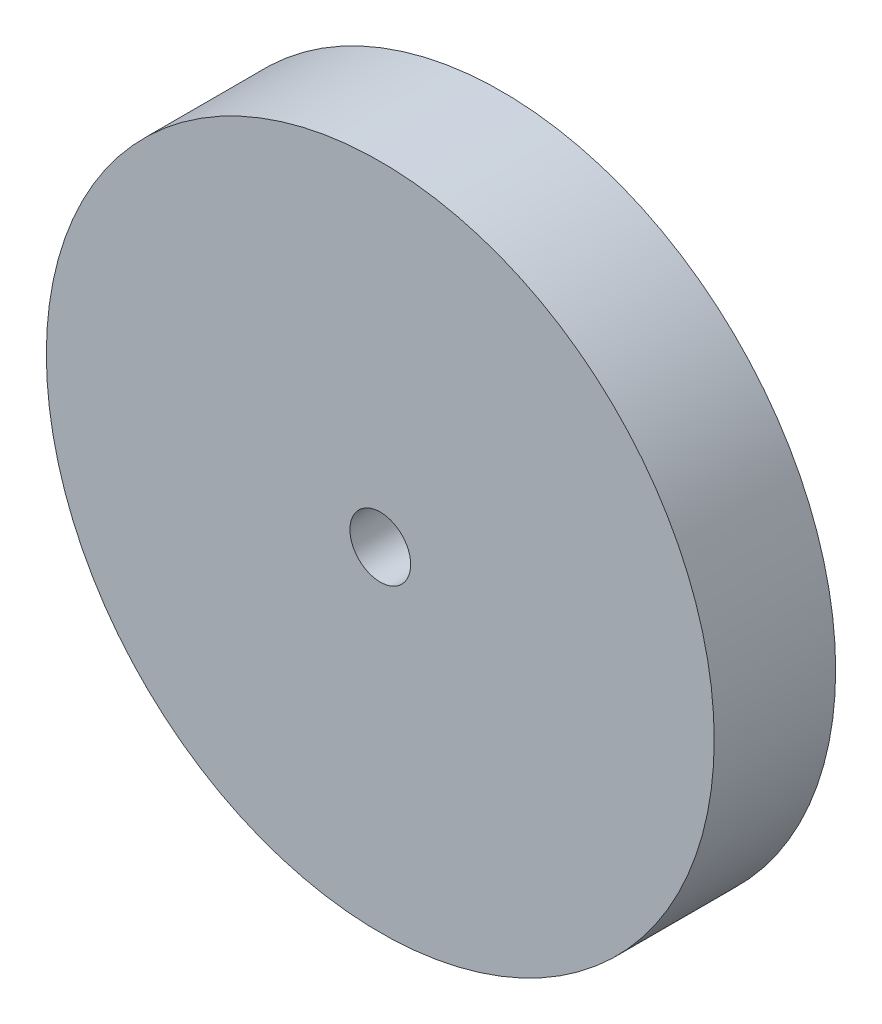
ISO-10303-21;
HEADER;
FILE_DESCRIPTION(('STEP AP214'),'2;1');
FILE_NAME('part.step','',(''),(''),'','','');
FILE_SCHEMA(('AUTOMOTIVE_DESIGN { 1 0 10303 214 1 1 1 1 }'));
ENDSEC;
DATA;
#1=APPLICATION_CONTEXT('core data for automotive mechanical design processes');
#2=APPLICATION_PROTOCOL_DEFINITION('international standard','automotive_design',2000,#1);
#3=PRODUCT_CONTEXT('',#1,'mechanical');
#4=PRODUCT('Part','Part','',(#3));
#5=PRODUCT_RELATED_PRODUCT_CATEGORY('part','',(#4));
#6=PRODUCT_DEFINITION_FORMATION('','',#4);
#7=PRODUCT_DEFINITION_CONTEXT('part definition',#1,'design');
#8=PRODUCT_DEFINITION('design','',#6,#7);
#9=PRODUCT_DEFINITION_SHAPE('','',#8);
#10=(LENGTH_UNIT() NAMED_UNIT(*) SI_UNIT(.MILLI.,.METRE.));
#11=(NAMED_UNIT(*) PLANE_ANGLE_UNIT() SI_UNIT($,.RADIAN.));
#12=(NAMED_UNIT(*) SI_UNIT($,.STERADIAN.) SOLID_ANGLE_UNIT());
#13=UNCERTAINTY_MEASURE_WITH_UNIT(LENGTH_MEASURE(1.E-05),#10,'distance_accuracy_value','');
#14=(GEOMETRIC_REPRESENTATION_CONTEXT(3) GLOBAL_UNCERTAINTY_ASSIGNED_CONTEXT((#13)) GLOBAL_UNIT_ASSIGNED_CONTEXT((#10,
#11,#12)) REPRESENTATION_CONTEXT('',''));
#15=CARTESIAN_POINT('',(0.,0.,0.));
#16=DIRECTION('',(0.,0.,1.));
#17=DIRECTION('',(1.,0.,0.));
#18=AXIS2_PLACEMENT_3D('',#15,#16,#17);
#19=CARTESIAN_POINT('',(0.,0.,5.));
#20=DIRECTION('',(0.,0.,1.));
#21=DIRECTION('',(1.,0.,0.));
#22=AXIS2_PLACEMENT_3D('',#19,#20,#21);
#23=PLANE('',#22);
#24=CARTESIAN_POINT('',(0.,0.,5.));
#25=DIRECTION('',(0.,0.,1.));
#26=DIRECTION('',(1.,0.,0.));
#27=AXIS2_PLACEMENT_3D('',#24,#25,#26);
#28=CIRCLE('',#27,27.5);
#29=CARTESIAN_POINT('',(27.5,0.,5.));
#30=VERTEX_POINT('',#29);
#31=EDGE_CURVE('E10',#30,#30,#28,.T.);
#32=ORIENTED_EDGE('',*,*,#31,.T.);
#33=EDGE_LOOP('',(#32));
#34=FACE_BOUND('',#33,.T.);
#35=CARTESIAN_POINT('',(0.,0.,5.));
#36=DIRECTION('',(0.,0.,1.));
#37=DIRECTION('',(1.,0.,0.));
#38=AXIS2_PLACEMENT_3D('',#35,#36,#37);
#39=CIRCLE('',#38,2.5);
#40=CARTESIAN_POINT('',(2.5,0.,5.));
#41=VERTEX_POINT('',#40);
#42=EDGE_CURVE('E50',#41,#41,#39,.T.);
#43=ORIENTED_EDGE('',*,*,#42,.F.);
#44=EDGE_LOOP('',(#43));
#45=FACE_BOUND('',#44,.T.);
#46=ADVANCED_FACE('F37',(#34,#45),#23,.T.);
#47=CARTESIAN_POINT('',(0.,0.,-5.));
#48=DIRECTION('',(0.,0.,1.));
#49=DIRECTION('',(1.,0.,0.));
#50=AXIS2_PLACEMENT_3D('',#47,#48,#49);
#51=PLANE('',#50);
#52=CARTESIAN_POINT('',(0.,0.,-5.));
#53=DIRECTION('',(0.,0.,1.));
#54=DIRECTION('',(1.,0.,0.));
#55=AXIS2_PLACEMENT_3D('',#52,#53,#54);
#56=CIRCLE('',#55,27.5);
#57=CARTESIAN_POINT('',(27.5,0.,-5.));
#58=VERTEX_POINT('',#57);
#59=EDGE_CURVE('E41',#58,#58,#56,.T.);
#60=ORIENTED_EDGE('',*,*,#59,.F.);
#61=EDGE_LOOP('',(#60));
#62=FACE_BOUND('',#61,.T.);
#63=CARTESIAN_POINT('',(0.,0.,-5.));
#64=DIRECTION('',(0.,0.,1.));
#65=DIRECTION('',(1.,0.,0.));
#66=AXIS2_PLACEMENT_3D('',#63,#64,#65);
#67=CIRCLE('',#66,2.5);
#68=CARTESIAN_POINT('',(2.5,0.,-5.));
#69=VERTEX_POINT('',#68);
#70=EDGE_CURVE('E52',#69,#69,#67,.T.);
#71=ORIENTED_EDGE('',*,*,#70,.T.);
#72=EDGE_LOOP('',(#71));
#73=FACE_BOUND('',#72,.T.);
#74=ADVANCED_FACE('F64',(#62,#73),#51,.F.);
#75=CARTESIAN_POINT('',(0.,0.,5.));
#76=DIRECTION('',(0.,0.,-1.));
#77=DIRECTION('',(-1.,0.,0.));
#78=AXIS2_PLACEMENT_3D('',#75,#76,#77);
#79=CYLINDRICAL_SURFACE('',#78,27.5);
#80=ORIENTED_EDGE('',*,*,#31,.F.);
#81=EDGE_LOOP('',(#80));
#82=FACE_BOUND('',#81,.T.);
#83=ORIENTED_EDGE('',*,*,#59,.T.);
#84=EDGE_LOOP('',(#83));
#85=FACE_BOUND('',#84,.T.);
#86=ADVANCED_FACE('F39',(#82,#85),#79,.T.);
#87=CARTESIAN_POINT('',(0.,0.,5.));
#88=DIRECTION('',(0.,0.,-1.));
#89=DIRECTION('',(-1.,0.,0.));
#90=AXIS2_PLACEMENT_3D('',#87,#88,#89);
#91=CYLINDRICAL_SURFACE('',#90,2.5);
#92=ORIENTED_EDGE('',*,*,#42,.T.);
#93=EDGE_LOOP('',(#92));
#94=FACE_BOUND('',#93,.T.);
#95=ORIENTED_EDGE('',*,*,#70,.F.);
#96=EDGE_LOOP('',(#95));
#97=FACE_BOUND('',#96,.T.);
#98=ADVANCED_FACE('F60',(#94,#97),#91,.F.);
#99=CLOSED_SHELL('',(#46,#74,#86,#98));
#100=MANIFOLD_SOLID_BREP('B2',#99);
#101=ADVANCED_BREP_SHAPE_REPRESENTATION('',(#18,#100),#14);
#102=SHAPE_DEFINITION_REPRESENTATION(#9,#101);
ENDSEC;
END-ISO-10303-21;
